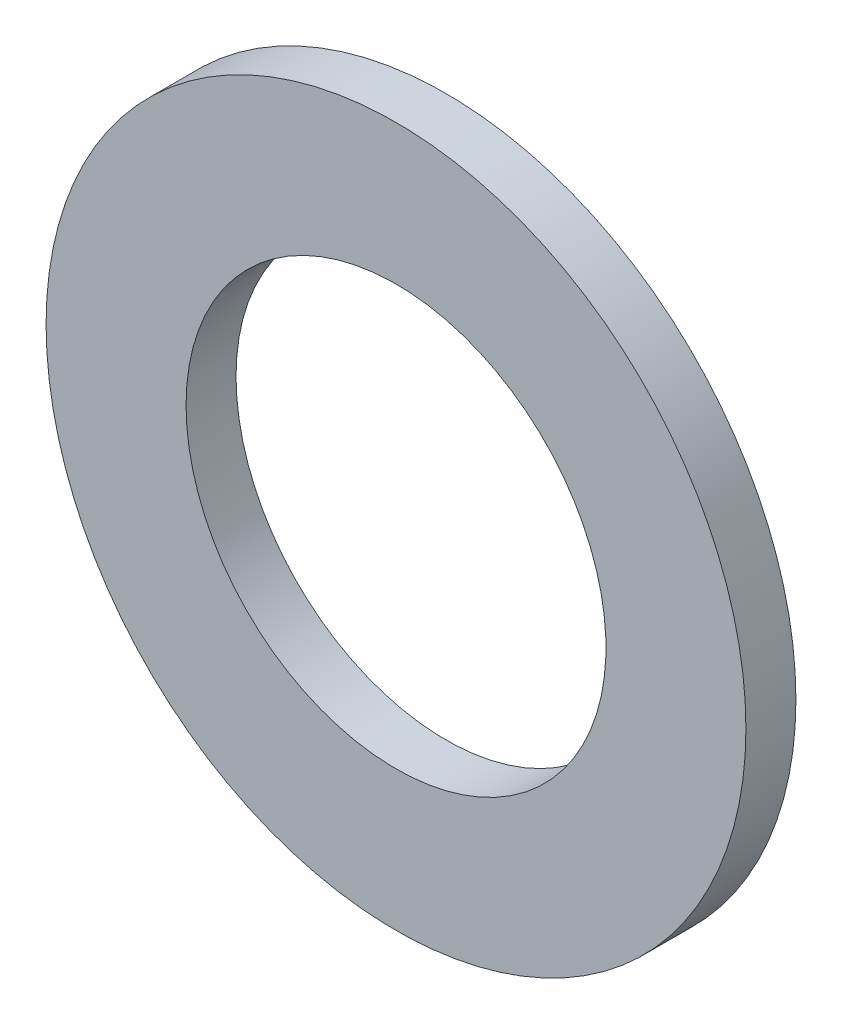
ISO-10303-21;
HEADER;
FILE_DESCRIPTION(('STEP AP214'),'2;1');
FILE_NAME('part.step','',(''),(''),'','','');
FILE_SCHEMA(('AUTOMOTIVE_DESIGN { 1 0 10303 214 1 1 1 1 }'));
ENDSEC;
DATA;
#1=APPLICATION_CONTEXT('core data for automotive mechanical design processes');
#2=APPLICATION_PROTOCOL_DEFINITION('international standard','automotive_design',2000,#1);
#3=PRODUCT_CONTEXT('',#1,'mechanical');
#4=PRODUCT('Part','Part','',(#3));
#5=PRODUCT_RELATED_PRODUCT_CATEGORY('part','',(#4));
#6=PRODUCT_DEFINITION_FORMATION('','',#4);
#7=PRODUCT_DEFINITION_CONTEXT('part definition',#1,'design');
#8=PRODUCT_DEFINITION('design','',#6,#7);
#9=PRODUCT_DEFINITION_SHAPE('','',#8);
#10=(LENGTH_UNIT() NAMED_UNIT(*) SI_UNIT(.MILLI.,.METRE.));
#11=(NAMED_UNIT(*) PLANE_ANGLE_UNIT() SI_UNIT($,.RADIAN.));
#12=(NAMED_UNIT(*) SI_UNIT($,.STERADIAN.) SOLID_ANGLE_UNIT());
#13=UNCERTAINTY_MEASURE_WITH_UNIT(LENGTH_MEASURE(1.E-05),#10,'distance_accuracy_value','');
#14=(GEOMETRIC_REPRESENTATION_CONTEXT(3) GLOBAL_UNCERTAINTY_ASSIGNED_CONTEXT((#13)) GLOBAL_UNIT_ASSIGNED_CONTEXT((#10,
#11,#12)) REPRESENTATION_CONTEXT('',''));
#15=CARTESIAN_POINT('',(0.,0.,0.));
#16=DIRECTION('',(0.,0.,1.));
#17=DIRECTION('',(1.,0.,0.));
#18=AXIS2_PLACEMENT_3D('',#15,#16,#17);
#19=CARTESIAN_POINT('',(0.,0.,0.5));
#20=DIRECTION('',(0.,0.,1.));
#21=DIRECTION('',(1.,0.,0.));
#22=AXIS2_PLACEMENT_3D('',#19,#20,#21);
#23=PLANE('',#22);
#24=CARTESIAN_POINT('',(0.,0.,0.5));
#25=DIRECTION('',(0.,0.,1.));
#26=DIRECTION('',(-1.,0.,0.));
#27=AXIS2_PLACEMENT_3D('',#24,#25,#26);
#28=CIRCLE('',#27,2.1);
#29=CARTESIAN_POINT('',(-2.1,0.,0.5));
#30=VERTEX_POINT('',#29);
#31=EDGE_CURVE('E36',#30,#30,#28,.T.);
#32=ORIENTED_EDGE('',*,*,#31,.F.);
#33=EDGE_LOOP('',(#32));
#34=FACE_BOUND('',#33,.T.);
#35=CARTESIAN_POINT('',(0.,0.,0.5));
#36=DIRECTION('',(0.,0.,-1.));
#37=DIRECTION('',(-1.,0.,0.));
#38=AXIS2_PLACEMENT_3D('',#35,#36,#37);
#39=CIRCLE('',#38,3.5);
#40=CARTESIAN_POINT('',(-3.5,0.,0.5));
#41=VERTEX_POINT('',#40);
#42=EDGE_CURVE('E10',#41,#41,#39,.T.);
#43=ORIENTED_EDGE('',*,*,#42,.F.);
#44=EDGE_LOOP('',(#43));
#45=FACE_BOUND('',#44,.T.);
#46=ADVANCED_FACE('F15',(#34,#45),#23,.T.);
#47=CARTESIAN_POINT('',(0.,0.,0.5));
#48=DIRECTION('',(0.,0.,-1.));
#49=DIRECTION('',(-1.,0.,0.));
#50=AXIS2_PLACEMENT_3D('',#47,#48,#49);
#51=CYLINDRICAL_SURFACE('',#50,3.5);
#52=ORIENTED_EDGE('',*,*,#42,.T.);
#53=EDGE_LOOP('',(#52));
#54=FACE_BOUND('',#53,.T.);
#55=CARTESIAN_POINT('',(0.,0.,0.));
#56=DIRECTION('',(0.,0.,1.));
#57=DIRECTION('',(-1.,0.,0.));
#58=AXIS2_PLACEMENT_3D('',#55,#56,#57);
#59=CIRCLE('',#58,3.5);
#60=CARTESIAN_POINT('',(-3.5,0.,0.));
#61=VERTEX_POINT('',#60);
#62=EDGE_CURVE('E18',#61,#61,#59,.T.);
#63=ORIENTED_EDGE('',*,*,#62,.T.);
#64=EDGE_LOOP('',(#63));
#65=FACE_BOUND('',#64,.T.);
#66=ADVANCED_FACE('F47',(#54,#65),#51,.T.);
#67=CARTESIAN_POINT('',(0.,0.,0.));
#68=DIRECTION('',(0.,0.,1.));
#69=DIRECTION('',(1.,0.,0.));
#70=AXIS2_PLACEMENT_3D('',#67,#68,#69);
#71=PLANE('',#70);
#72=CARTESIAN_POINT('',(0.,0.,0.));
#73=DIRECTION('',(0.,0.,-1.));
#74=DIRECTION('',(1.,-1.370110585399E-10,0.));
#75=AXIS2_PLACEMENT_3D('',#72,#73,#74);
#76=CIRCLE('',#75,2.1);
#77=CARTESIAN_POINT('',(2.1,-2.8772322293379E-10,0.));
#78=VERTEX_POINT('',#77);
#79=EDGE_CURVE('E31',#78,#78,#76,.T.);
#80=ORIENTED_EDGE('',*,*,#79,.F.);
#81=EDGE_LOOP('',(#80));
#82=FACE_BOUND('',#81,.T.);
#83=ORIENTED_EDGE('',*,*,#62,.F.);
#84=EDGE_LOOP('',(#83));
#85=FACE_BOUND('',#84,.T.);
#86=ADVANCED_FACE('F52',(#82,#85),#71,.F.);
#87=CARTESIAN_POINT('',(0.,0.,0.5));
#88=DIRECTION('',(0.,0.,-1.));
#89=DIRECTION('',(-1.,0.,0.));
#90=AXIS2_PLACEMENT_3D('',#87,#88,#89);
#91=CYLINDRICAL_SURFACE('',#90,2.1);
#92=ORIENTED_EDGE('',*,*,#79,.T.);
#93=EDGE_LOOP('',(#92));
#94=FACE_BOUND('',#93,.T.);
#95=ORIENTED_EDGE('',*,*,#31,.T.);
#96=EDGE_LOOP('',(#95));
#97=FACE_BOUND('',#96,.T.);
#98=ADVANCED_FACE('F43',(#94,#97),#91,.F.);
#99=CLOSED_SHELL('',(#46,#66,#86,#98));
#100=MANIFOLD_SOLID_BREP('B1',#99);
#101=ADVANCED_BREP_SHAPE_REPRESENTATION('',(#18,#100),#14);
#102=SHAPE_DEFINITION_REPRESENTATION(#9,#101);
ENDSEC;
END-ISO-10303-21;
